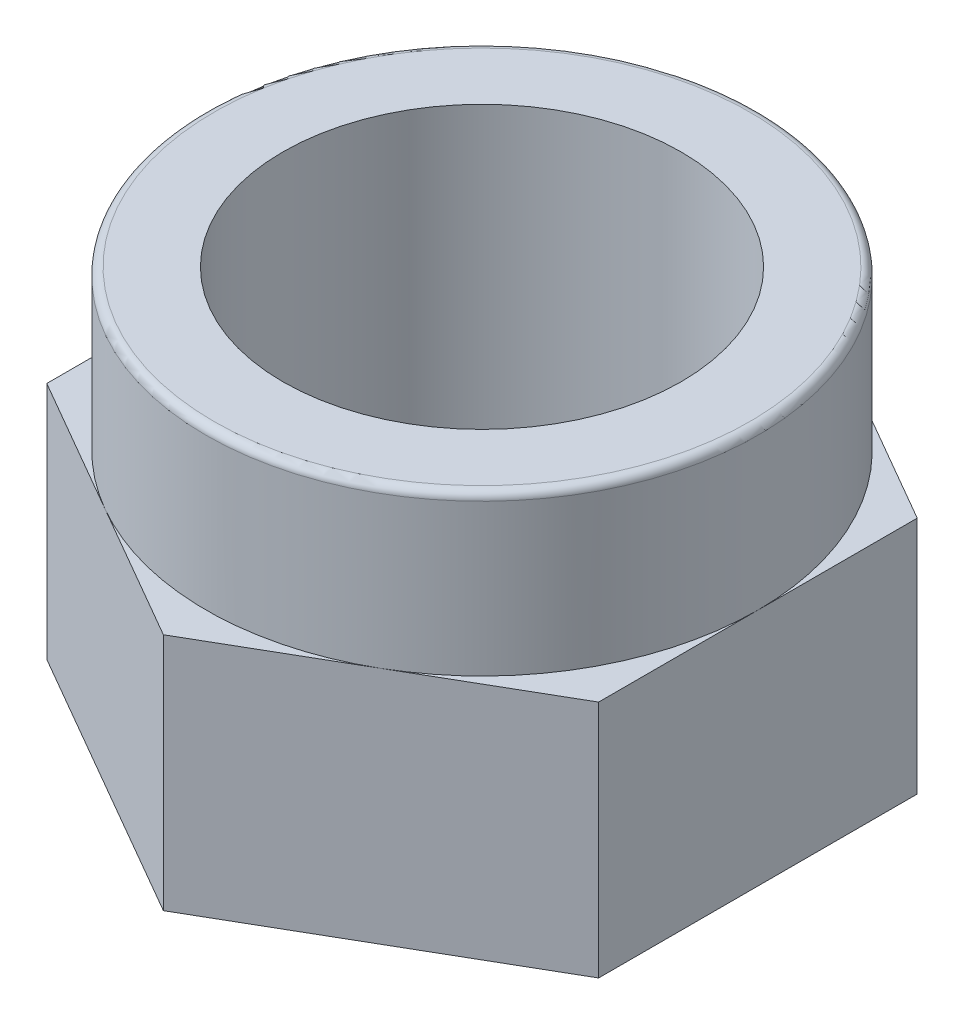
ISO-10303-21;
HEADER;
FILE_DESCRIPTION(('STEP AP214'),'2;1');
FILE_NAME('part.step','',(''),(''),'','','');
FILE_SCHEMA(('AUTOMOTIVE_DESIGN { 1 0 10303 214 1 1 1 1 }'));
ENDSEC;
DATA;
#1=APPLICATION_CONTEXT('core data for automotive mechanical design processes');
#2=APPLICATION_PROTOCOL_DEFINITION('international standard','automotive_design',2000,#1);
#3=PRODUCT_CONTEXT('',#1,'mechanical');
#4=PRODUCT('Part','Part','',(#3));
#5=PRODUCT_RELATED_PRODUCT_CATEGORY('part','',(#4));
#6=PRODUCT_DEFINITION_FORMATION('','',#4);
#7=PRODUCT_DEFINITION_CONTEXT('part definition',#1,'design');
#8=PRODUCT_DEFINITION('design','',#6,#7);
#9=PRODUCT_DEFINITION_SHAPE('','',#8);
#10=(LENGTH_UNIT() NAMED_UNIT(*) SI_UNIT(.MILLI.,.METRE.));
#11=(NAMED_UNIT(*) PLANE_ANGLE_UNIT() SI_UNIT($,.RADIAN.));
#12=(NAMED_UNIT(*) SI_UNIT($,.STERADIAN.) SOLID_ANGLE_UNIT());
#13=UNCERTAINTY_MEASURE_WITH_UNIT(LENGTH_MEASURE(1.E-05),#10,'distance_accuracy_value','');
#14=(GEOMETRIC_REPRESENTATION_CONTEXT(3) GLOBAL_UNCERTAINTY_ASSIGNED_CONTEXT((#13)) GLOBAL_UNIT_ASSIGNED_CONTEXT((#10,
#11,#12)) REPRESENTATION_CONTEXT('',''));
#15=CARTESIAN_POINT('',(0.,0.,0.));
#16=DIRECTION('',(0.,0.,1.));
#17=DIRECTION('',(1.,0.,0.));
#18=AXIS2_PLACEMENT_3D('',#15,#16,#17);
#19=CARTESIAN_POINT('',(0.,3.,0.));
#20=DIRECTION('',(0.,1.,0.));
#21=DIRECTION('',(0.,0.,1.));
#22=AXIS2_PLACEMENT_3D('',#19,#20,#21);
#23=PLANE('',#22);
#24=CARTESIAN_POINT('',(0.,3.,0.));
#25=DIRECTION('',(0.,1.,0.));
#26=DIRECTION('',(0.,0.,1.));
#27=AXIS2_PLACEMENT_3D('',#24,#25,#26);
#28=CIRCLE('',#27,3.46410161513777);
#29=CARTESIAN_POINT('',(1.73205080756891,3.,3.));
#30=VERTEX_POINT('',#29);
#31=CARTESIAN_POINT('',(3.46410161513775,3.,0.));
#32=VERTEX_POINT('',#31);
#33=EDGE_CURVE('E133',#30,#32,#28,.T.);
#34=ORIENTED_EDGE('',*,*,#33,.F.);
#35=DIRECTION('',(0.866025403784434,0.,-0.500000000000007));
#36=VECTOR('',#35,1.);
#37=CARTESIAN_POINT('',(0.,3.,4.));
#38=LINE('',#37,#36);
#39=CARTESIAN_POINT('',(3.46410161513777,3.,1.99999999999997));
#40=VERTEX_POINT('',#39);
#41=EDGE_CURVE('E121',#30,#40,#38,.T.);
#42=ORIENTED_EDGE('',*,*,#41,.T.);
#43=DIRECTION('',(0.,0.,-1.));
#44=VECTOR('',#43,1.);
#45=CARTESIAN_POINT('',(3.46410161513777,3.,1.99999999999997));
#46=LINE('',#45,#44);
#47=EDGE_CURVE('E134',#40,#32,#46,.T.);
#48=ORIENTED_EDGE('',*,*,#47,.T.);
#49=EDGE_LOOP('',(#34,#42,#48));
#50=FACE_BOUND('',#49,.T.);
#51=ADVANCED_FACE('F43',(#50),#23,.T.);
#52=CARTESIAN_POINT('',(1.73205080756887,3.,-3.00000000000002));
#53=VERTEX_POINT('',#52);
#54=EDGE_CURVE('E58',#32,#53,#28,.T.);
#55=ORIENTED_EDGE('',*,*,#54,.F.);
#56=CARTESIAN_POINT('',(3.46410161513773,3.,-2.00000000000004));
#57=VERTEX_POINT('',#56);
#58=EDGE_CURVE('E120',#32,#57,#46,.T.);
#59=ORIENTED_EDGE('',*,*,#58,.T.);
#60=DIRECTION('',(-0.866025403784441,0.,-0.499999999999995));
#61=VECTOR('',#60,1.);
#62=CARTESIAN_POINT('',(3.46410161513773,3.,-2.00000000000004));
#63=LINE('',#62,#61);
#64=EDGE_CURVE('E153',#57,#53,#63,.T.);
#65=ORIENTED_EDGE('',*,*,#64,.T.);
#66=EDGE_LOOP('',(#55,#59,#65));
#67=FACE_BOUND('',#66,.T.);
#68=ADVANCED_FACE('F209',(#67),#23,.T.);
#69=CARTESIAN_POINT('',(-1.73205080756888,3.,-3.));
#70=VERTEX_POINT('',#69);
#71=EDGE_CURVE('E192',#53,#70,#28,.T.);
#72=ORIENTED_EDGE('',*,*,#71,.F.);
#73=CARTESIAN_POINT('',(0.,3.,-4.));
#74=VERTEX_POINT('',#73);
#75=EDGE_CURVE('E156',#53,#74,#63,.T.);
#76=ORIENTED_EDGE('',*,*,#75,.T.);
#77=DIRECTION('',(-0.866025403784438,0.,0.500000000000001));
#78=VECTOR('',#77,1.);
#79=CARTESIAN_POINT('',(0.,3.,-4.));
#80=LINE('',#79,#78);
#81=EDGE_CURVE('E157',#74,#70,#80,.T.);
#82=ORIENTED_EDGE('',*,*,#81,.T.);
#83=EDGE_LOOP('',(#72,#76,#82));
#84=FACE_BOUND('',#83,.T.);
#85=ADVANCED_FACE('F204',(#84),#23,.T.);
#86=CARTESIAN_POINT('',(-3.46410161513775,3.,0.));
#87=VERTEX_POINT('',#86);
#88=EDGE_CURVE('E144',#70,#87,#28,.T.);
#89=ORIENTED_EDGE('',*,*,#88,.F.);
#90=CARTESIAN_POINT('',(-3.46410161513776,3.,-1.99999999999999));
#91=VERTEX_POINT('',#90);
#92=EDGE_CURVE('E155',#70,#91,#80,.T.);
#93=ORIENTED_EDGE('',*,*,#92,.T.);
#94=DIRECTION('',(0.,0.,1.));
#95=VECTOR('',#94,1.);
#96=CARTESIAN_POINT('',(-3.46410161513776,3.,-1.99999999999999));
#97=LINE('',#96,#95);
#98=EDGE_CURVE('E161',#91,#87,#97,.T.);
#99=ORIENTED_EDGE('',*,*,#98,.T.);
#100=EDGE_LOOP('',(#89,#93,#99));
#101=FACE_BOUND('',#100,.T.);
#102=ADVANCED_FACE('F196',(#101),#23,.T.);
#103=CARTESIAN_POINT('',(-1.73205080756886,3.,3.00000000000001));
#104=VERTEX_POINT('',#103);
#105=EDGE_CURVE('E142',#87,#104,#28,.T.);
#106=ORIENTED_EDGE('',*,*,#105,.F.);
#107=CARTESIAN_POINT('',(-3.46410161513775,3.,2.00000000000002));
#108=VERTEX_POINT('',#107);
#109=EDGE_CURVE('E160',#87,#108,#97,.T.);
#110=ORIENTED_EDGE('',*,*,#109,.T.);
#111=DIRECTION('',(0.866025403784442,0.,0.499999999999995));
#112=VECTOR('',#111,1.);
#113=CARTESIAN_POINT('',(-3.46410161513775,3.,2.00000000000002));
#114=LINE('',#113,#112);
#115=EDGE_CURVE('E131',#108,#104,#114,.T.);
#116=ORIENTED_EDGE('',*,*,#115,.T.);
#117=EDGE_LOOP('',(#106,#110,#116));
#118=FACE_BOUND('',#117,.T.);
#119=ADVANCED_FACE('F227',(#118),#23,.T.);
#120=EDGE_CURVE('E66',#104,#30,#28,.T.);
#121=ORIENTED_EDGE('',*,*,#120,.F.);
#122=CARTESIAN_POINT('',(0.,3.,4.));
#123=VERTEX_POINT('',#122);
#124=EDGE_CURVE('E116',#104,#123,#114,.T.);
#125=ORIENTED_EDGE('',*,*,#124,.T.);
#126=EDGE_CURVE('E113',#123,#30,#38,.T.);
#127=ORIENTED_EDGE('',*,*,#126,.T.);
#128=EDGE_LOOP('',(#121,#125,#127));
#129=FACE_BOUND('',#128,.T.);
#130=ADVANCED_FACE('F115',(#129),#23,.T.);
#131=CARTESIAN_POINT('',(0.,0.,0.));
#132=DIRECTION('',(0.,1.,0.));
#133=DIRECTION('',(0.,0.,1.));
#134=AXIS2_PLACEMENT_3D('',#131,#132,#133);
#135=PLANE('',#134);
#136=DIRECTION('',(-0.866025403784441,0.,-0.499999999999995));
#137=VECTOR('',#136,1.);
#138=CARTESIAN_POINT('',(3.46410161513773,0.,-2.00000000000004));
#139=LINE('',#138,#137);
#140=CARTESIAN_POINT('',(3.46410161513773,0.,-2.00000000000004));
#141=VERTEX_POINT('',#140);
#142=CARTESIAN_POINT('',(0.,0.,-4.));
#143=VERTEX_POINT('',#142);
#144=EDGE_CURVE('E152',#141,#143,#139,.T.);
#145=ORIENTED_EDGE('',*,*,#144,.F.);
#146=DIRECTION('',(0.,0.,-1.));
#147=VECTOR('',#146,1.);
#148=CARTESIAN_POINT('',(3.46410161513777,0.,1.99999999999997));
#149=LINE('',#148,#147);
#150=CARTESIAN_POINT('',(3.46410161513777,0.,1.99999999999997));
#151=VERTEX_POINT('',#150);
#152=EDGE_CURVE('E178',#151,#141,#149,.T.);
#153=ORIENTED_EDGE('',*,*,#152,.F.);
#154=DIRECTION('',(0.866025403784434,0.,-0.500000000000007));
#155=VECTOR('',#154,1.);
#156=CARTESIAN_POINT('',(0.,0.,4.));
#157=LINE('',#156,#155);
#158=CARTESIAN_POINT('',(0.,0.,4.));
#159=VERTEX_POINT('',#158);
#160=EDGE_CURVE('E176',#159,#151,#157,.T.);
#161=ORIENTED_EDGE('',*,*,#160,.F.);
#162=DIRECTION('',(0.866025403784442,0.,0.499999999999995));
#163=VECTOR('',#162,1.);
#164=CARTESIAN_POINT('',(-3.46410161513775,0.,2.00000000000002));
#165=LINE('',#164,#163);
#166=CARTESIAN_POINT('',(-3.46410161513775,0.,2.00000000000002));
#167=VERTEX_POINT('',#166);
#168=EDGE_CURVE('E174',#167,#159,#165,.T.);
#169=ORIENTED_EDGE('',*,*,#168,.F.);
#170=DIRECTION('',(0.,0.,1.));
#171=VECTOR('',#170,1.);
#172=CARTESIAN_POINT('',(-3.46410161513776,0.,-1.99999999999999));
#173=LINE('',#172,#171);
#174=CARTESIAN_POINT('',(-3.46410161513776,0.,-1.99999999999999));
#175=VERTEX_POINT('',#174);
#176=EDGE_CURVE('E172',#175,#167,#173,.T.);
#177=ORIENTED_EDGE('',*,*,#176,.F.);
#178=DIRECTION('',(-0.866025403784438,0.,0.500000000000001));
#179=VECTOR('',#178,1.);
#180=CARTESIAN_POINT('',(0.,0.,-4.));
#181=LINE('',#180,#179);
#182=EDGE_CURVE('E170',#143,#175,#181,.T.);
#183=ORIENTED_EDGE('',*,*,#182,.F.);
#184=EDGE_LOOP('',(#145,#153,#161,#169,#177,#183));
#185=FACE_BOUND('',#184,.T.);
#186=CARTESIAN_POINT('',(0.,0.,0.));
#187=DIRECTION('',(0.,1.,0.));
#188=DIRECTION('',(0.,0.,1.));
#189=AXIS2_PLACEMENT_3D('',#186,#187,#188);
#190=CIRCLE('',#189,2.5);
#191=CARTESIAN_POINT('',(0.,0.,2.5));
#192=VERTEX_POINT('',#191);
#193=EDGE_CURVE('E136',#192,#192,#190,.T.);
#194=ORIENTED_EDGE('',*,*,#193,.T.);
#195=EDGE_LOOP('',(#194));
#196=FACE_BOUND('',#195,.T.);
#197=ADVANCED_FACE('F216',(#185,#196),#135,.F.);
#198=CARTESIAN_POINT('',(3.46410161513773,3.,-2.00000000000004));
#199=DIRECTION('',(-0.499999999999995,0.,0.866025403784441));
#200=DIRECTION('',(0.866025403784441,0.,0.499999999999995));
#201=AXIS2_PLACEMENT_3D('',#198,#199,#200);
#202=PLANE('',#201);
#203=ORIENTED_EDGE('',*,*,#144,.T.);
#204=DIRECTION('',(0.,-1.,0.));
#205=VECTOR('',#204,1.);
#206=CARTESIAN_POINT('',(0.,3.,-4.));
#207=LINE('',#206,#205);
#208=EDGE_CURVE('E143',#74,#143,#207,.T.);
#209=ORIENTED_EDGE('',*,*,#208,.F.);
#210=ORIENTED_EDGE('',*,*,#75,.F.);
#211=ORIENTED_EDGE('',*,*,#64,.F.);
#212=DIRECTION('',(0.,-1.,0.));
#213=VECTOR('',#212,1.);
#214=CARTESIAN_POINT('',(3.46410161513773,3.,-2.00000000000004));
#215=LINE('',#214,#213);
#216=EDGE_CURVE('E167',#57,#141,#215,.T.);
#217=ORIENTED_EDGE('',*,*,#216,.T.);
#218=EDGE_LOOP('',(#203,#209,#210,#211,#217));
#219=FACE_BOUND('',#218,.T.);
#220=ADVANCED_FACE('F208',(#219),#202,.F.);
#221=CARTESIAN_POINT('',(0.,3.,-4.));
#222=DIRECTION('',(0.500000000000001,0.,0.866025403784438));
#223=DIRECTION('',(0.866025403784438,0.,-0.500000000000001));
#224=AXIS2_PLACEMENT_3D('',#221,#222,#223);
#225=PLANE('',#224);
#226=ORIENTED_EDGE('',*,*,#182,.T.);
#227=DIRECTION('',(0.,-1.,0.));
#228=VECTOR('',#227,1.);
#229=CARTESIAN_POINT('',(-3.46410161513776,3.,-1.99999999999999));
#230=LINE('',#229,#228);
#231=EDGE_CURVE('E146',#91,#175,#230,.T.);
#232=ORIENTED_EDGE('',*,*,#231,.F.);
#233=ORIENTED_EDGE('',*,*,#92,.F.);
#234=ORIENTED_EDGE('',*,*,#81,.F.);
#235=ORIENTED_EDGE('',*,*,#208,.T.);
#236=EDGE_LOOP('',(#226,#232,#233,#234,#235));
#237=FACE_BOUND('',#236,.T.);
#238=ADVANCED_FACE('F201',(#237),#225,.F.);
#239=CARTESIAN_POINT('',(-3.46410161513776,3.,-1.99999999999999));
#240=DIRECTION('',(1.,0.,0.));
#241=DIRECTION('',(0.,0.,-1.));
#242=AXIS2_PLACEMENT_3D('',#239,#240,#241);
#243=PLANE('',#242);
#244=ORIENTED_EDGE('',*,*,#176,.T.);
#245=DIRECTION('',(0.,-1.,0.));
#246=VECTOR('',#245,1.);
#247=CARTESIAN_POINT('',(-3.46410161513775,3.,2.00000000000002));
#248=LINE('',#247,#246);
#249=EDGE_CURVE('E185',#108,#167,#248,.T.);
#250=ORIENTED_EDGE('',*,*,#249,.F.);
#251=ORIENTED_EDGE('',*,*,#109,.F.);
#252=ORIENTED_EDGE('',*,*,#98,.F.);
#253=ORIENTED_EDGE('',*,*,#231,.T.);
#254=EDGE_LOOP('',(#244,#250,#251,#252,#253));
#255=FACE_BOUND('',#254,.T.);
#256=ADVANCED_FACE('F222',(#255),#243,.F.);
#257=CARTESIAN_POINT('',(-3.46410161513775,3.,2.00000000000002));
#258=DIRECTION('',(0.499999999999995,0.,-0.866025403784441));
#259=DIRECTION('',(-0.866025403784442,0.,-0.499999999999995));
#260=AXIS2_PLACEMENT_3D('',#257,#258,#259);
#261=PLANE('',#260);
#262=ORIENTED_EDGE('',*,*,#168,.T.);
#263=DIRECTION('',(0.,-1.,0.));
#264=VECTOR('',#263,1.);
#265=CARTESIAN_POINT('',(0.,3.,4.));
#266=LINE('',#265,#264);
#267=EDGE_CURVE('E183',#123,#159,#266,.T.);
#268=ORIENTED_EDGE('',*,*,#267,.F.);
#269=ORIENTED_EDGE('',*,*,#124,.F.);
#270=ORIENTED_EDGE('',*,*,#115,.F.);
#271=ORIENTED_EDGE('',*,*,#249,.T.);
#272=EDGE_LOOP('',(#262,#268,#269,#270,#271));
#273=FACE_BOUND('',#272,.T.);
#274=ADVANCED_FACE('F229',(#273),#261,.F.);
#275=CARTESIAN_POINT('',(0.,3.,4.));
#276=DIRECTION('',(-0.500000000000007,0.,-0.866025403784435));
#277=DIRECTION('',(-0.866025403784434,0.,0.500000000000007));
#278=AXIS2_PLACEMENT_3D('',#275,#276,#277);
#279=PLANE('',#278);
#280=ORIENTED_EDGE('',*,*,#160,.T.);
#281=DIRECTION('',(0.,-1.,0.));
#282=VECTOR('',#281,1.);
#283=CARTESIAN_POINT('',(3.46410161513777,3.,1.99999999999997));
#284=LINE('',#283,#282);
#285=EDGE_CURVE('E127',#40,#151,#284,.T.);
#286=ORIENTED_EDGE('',*,*,#285,.F.);
#287=ORIENTED_EDGE('',*,*,#41,.F.);
#288=ORIENTED_EDGE('',*,*,#126,.F.);
#289=ORIENTED_EDGE('',*,*,#267,.T.);
#290=EDGE_LOOP('',(#280,#286,#287,#288,#289));
#291=FACE_BOUND('',#290,.T.);
#292=ADVANCED_FACE('F125',(#291),#279,.F.);
#293=CARTESIAN_POINT('',(3.46410161513777,3.,1.99999999999997));
#294=DIRECTION('',(-1.,0.,0.));
#295=DIRECTION('',(0.,0.,1.));
#296=AXIS2_PLACEMENT_3D('',#293,#294,#295);
#297=PLANE('',#296);
#298=ORIENTED_EDGE('',*,*,#152,.T.);
#299=ORIENTED_EDGE('',*,*,#216,.F.);
#300=ORIENTED_EDGE('',*,*,#58,.F.);
#301=ORIENTED_EDGE('',*,*,#47,.F.);
#302=ORIENTED_EDGE('',*,*,#285,.T.);
#303=EDGE_LOOP('',(#298,#299,#300,#301,#302));
#304=FACE_BOUND('',#303,.T.);
#305=ADVANCED_FACE('F212',(#304),#297,.F.);
#306=CARTESIAN_POINT('',(0.,3.,0.));
#307=DIRECTION('',(0.,-1.,0.));
#308=DIRECTION('',(0.,0.,-1.));
#309=AXIS2_PLACEMENT_3D('',#306,#307,#308);
#310=CYLINDRICAL_SURFACE('',#309,2.5);
#311=ORIENTED_EDGE('',*,*,#193,.F.);
#312=EDGE_LOOP('',(#311));
#313=FACE_BOUND('',#312,.T.);
#314=CARTESIAN_POINT('',(0.,5.,0.));
#315=DIRECTION('',(0.,1.,0.));
#316=DIRECTION('',(0.,0.,1.));
#317=AXIS2_PLACEMENT_3D('',#314,#315,#316);
#318=CIRCLE('',#317,2.5);
#319=CARTESIAN_POINT('',(0.,5.,2.5));
#320=VERTEX_POINT('',#319);
#321=EDGE_CURVE('E137',#320,#320,#318,.T.);
#322=ORIENTED_EDGE('',*,*,#321,.T.);
#323=EDGE_LOOP('',(#322));
#324=FACE_BOUND('',#323,.T.);
#325=ADVANCED_FACE('F276',(#313,#324),#310,.F.);
#326=CARTESIAN_POINT('',(0.,5.,0.));
#327=DIRECTION('',(0.,1.,0.));
#328=DIRECTION('',(0.,0.,1.));
#329=AXIS2_PLACEMENT_3D('',#326,#327,#328);
#330=PLANE('',#329);
#331=CARTESIAN_POINT('',(0.,5.,0.));
#332=DIRECTION('',(0.,1.,0.));
#333=DIRECTION('',(0.,0.,1.));
#334=AXIS2_PLACEMENT_3D('',#331,#332,#333);
#335=CIRCLE('',#334,3.36410161513777);
#336=CARTESIAN_POINT('',(0.,5.,3.36410161513777));
#337=VERTEX_POINT('',#336);
#338=EDGE_CURVE('E51',#337,#337,#335,.T.);
#339=ORIENTED_EDGE('',*,*,#338,.T.);
#340=EDGE_LOOP('',(#339));
#341=FACE_BOUND('',#340,.T.);
#342=ORIENTED_EDGE('',*,*,#321,.F.);
#343=EDGE_LOOP('',(#342));
#344=FACE_BOUND('',#343,.T.);
#345=ADVANCED_FACE('F282',(#341,#344),#330,.T.);
#346=CARTESIAN_POINT('',(0.,5.,0.));
#347=DIRECTION('',(0.,-1.,0.));
#348=DIRECTION('',(0.,0.,-1.));
#349=AXIS2_PLACEMENT_3D('',#346,#347,#348);
#350=CYLINDRICAL_SURFACE('',#349,3.46410161513777);
#351=CARTESIAN_POINT('',(0.,4.9,0.));
#352=DIRECTION('',(0.,1.,0.));
#353=DIRECTION('',(0.,0.,1.));
#354=AXIS2_PLACEMENT_3D('',#351,#352,#353);
#355=CIRCLE('',#354,3.46410161513777);
#356=CARTESIAN_POINT('',(0.,4.9,3.46410161513777));
#357=VERTEX_POINT('',#356);
#358=EDGE_CURVE('E11',#357,#357,#355,.F.);
#359=ORIENTED_EDGE('',*,*,#358,.T.);
#360=EDGE_LOOP('',(#359));
#361=FACE_BOUND('',#360,.T.);
#362=ORIENTED_EDGE('',*,*,#33,.T.);
#363=ORIENTED_EDGE('',*,*,#54,.T.);
#364=ORIENTED_EDGE('',*,*,#71,.T.);
#365=ORIENTED_EDGE('',*,*,#88,.T.);
#366=ORIENTED_EDGE('',*,*,#105,.T.);
#367=ORIENTED_EDGE('',*,*,#120,.T.);
#368=EDGE_LOOP('',(#362,#363,#364,#365,#366,#367));
#369=FACE_BOUND('',#368,.T.);
#370=ADVANCED_FACE('F140',(#361,#369),#350,.T.);
#371=CARTESIAN_POINT('',(0.,4.9,0.));
#372=DIRECTION('',(0.,1.,0.));
#373=DIRECTION('',(0.,0.,1.));
#374=AXIS2_PLACEMENT_3D('',#371,#372,#373);
#375=TOROIDAL_SURFACE('',#374,3.36410161513777,0.1);
#376=ORIENTED_EDGE('',*,*,#358,.F.);
#377=EDGE_LOOP('',(#376));
#378=FACE_BOUND('',#377,.T.);
#379=ORIENTED_EDGE('',*,*,#338,.F.);
#380=EDGE_LOOP('',(#379));
#381=FACE_BOUND('',#380,.T.);
#382=ADVANCED_FACE('F45',(#378,#381),#375,.T.);
#383=CLOSED_SHELL('',(#51,#68,#85,#102,#119,#130,#197,#220,#238,#256,#274,#292,#305,#325,#345,
#370,#382));
#384=MANIFOLD_SOLID_BREP('B2',#383);
#385=ADVANCED_BREP_SHAPE_REPRESENTATION('',(#18,#384),#14);
#386=SHAPE_DEFINITION_REPRESENTATION(#9,#385);
ENDSEC;
END-ISO-10303-21;
